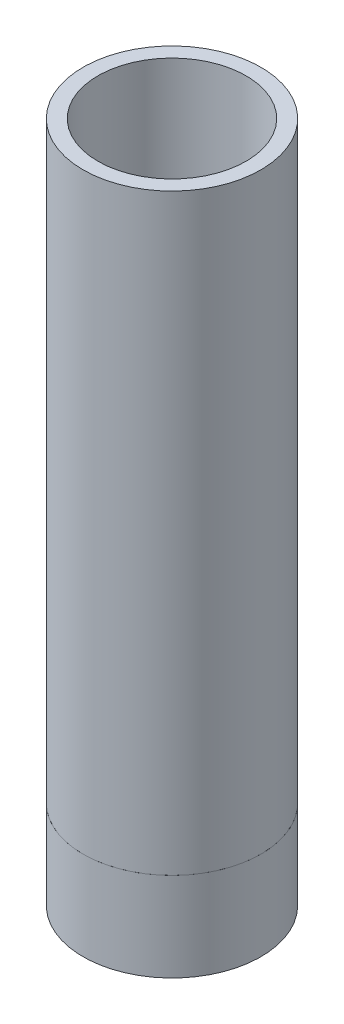
ISO-10303-21;
HEADER;
FILE_DESCRIPTION(('STEP AP214'),'2;1');
FILE_NAME('part.step','',(''),(''),'','','');
FILE_SCHEMA(('AUTOMOTIVE_DESIGN { 1 0 10303 214 1 1 1 1 }'));
ENDSEC;
DATA;
#1=APPLICATION_CONTEXT('core data for automotive mechanical design processes');
#2=APPLICATION_PROTOCOL_DEFINITION('international standard','automotive_design',2000,#1);
#3=PRODUCT_CONTEXT('',#1,'mechanical');
#4=PRODUCT('Part','Part','',(#3));
#5=PRODUCT_RELATED_PRODUCT_CATEGORY('part','',(#4));
#6=PRODUCT_DEFINITION_FORMATION('','',#4);
#7=PRODUCT_DEFINITION_CONTEXT('part definition',#1,'design');
#8=PRODUCT_DEFINITION('design','',#6,#7);
#9=PRODUCT_DEFINITION_SHAPE('','',#8);
#10=(LENGTH_UNIT() NAMED_UNIT(*) SI_UNIT(.MILLI.,.METRE.));
#11=(NAMED_UNIT(*) PLANE_ANGLE_UNIT() SI_UNIT($,.RADIAN.));
#12=(NAMED_UNIT(*) SI_UNIT($,.STERADIAN.) SOLID_ANGLE_UNIT());
#13=UNCERTAINTY_MEASURE_WITH_UNIT(LENGTH_MEASURE(1.E-05),#10,'distance_accuracy_value','');
#14=(GEOMETRIC_REPRESENTATION_CONTEXT(3) GLOBAL_UNCERTAINTY_ASSIGNED_CONTEXT((#13)) GLOBAL_UNIT_ASSIGNED_CONTEXT((#10,
#11,#12)) REPRESENTATION_CONTEXT('',''));
#15=CARTESIAN_POINT('',(0.,0.,0.));
#16=DIRECTION('',(0.,0.,1.));
#17=DIRECTION('',(1.,0.,0.));
#18=AXIS2_PLACEMENT_3D('',#15,#16,#17);
#19=CARTESIAN_POINT('',(0.,-15.,0.));
#20=DIRECTION('',(0.,-1.,0.));
#21=DIRECTION('',(0.,0.,-1.));
#22=AXIS2_PLACEMENT_3D('',#19,#20,#21);
#23=PLANE('',#22);
#24=CARTESIAN_POINT('',(0.,-15.,0.));
#25=DIRECTION('',(0.,-1.,0.));
#26=DIRECTION('',(0.,0.,-1.));
#27=AXIS2_PLACEMENT_3D('',#24,#25,#26);
#28=CIRCLE('',#27,15.);
#29=CARTESIAN_POINT('',(0.,-15.,-15.));
#30=VERTEX_POINT('',#29);
#31=EDGE_CURVE('E11',#30,#30,#28,.T.);
#32=ORIENTED_EDGE('',*,*,#31,.T.);
#33=EDGE_LOOP('',(#32));
#34=FACE_BOUND('',#33,.T.);
#35=CARTESIAN_POINT('',(0.,-15.,0.));
#36=DIRECTION('',(0.,-1.,0.));
#37=DIRECTION('',(0.,0.,-1.));
#38=AXIS2_PLACEMENT_3D('',#35,#36,#37);
#39=CIRCLE('',#38,12.5);
#40=CARTESIAN_POINT('',(0.,-15.,-12.5));
#41=VERTEX_POINT('',#40);
#42=EDGE_CURVE('E55',#41,#41,#39,.T.);
#43=ORIENTED_EDGE('',*,*,#42,.F.);
#44=EDGE_LOOP('',(#43));
#45=FACE_BOUND('',#44,.T.);
#46=ADVANCED_FACE('F44',(#34,#45),#23,.T.);
#47=CARTESIAN_POINT('',(0.,0.,0.));
#48=DIRECTION('',(0.,-1.,0.));
#49=DIRECTION('',(0.,0.,-1.));
#50=AXIS2_PLACEMENT_3D('',#47,#48,#49);
#51=PLANE('',#50);
#52=CARTESIAN_POINT('',(0.,0.,0.));
#53=DIRECTION('',(0.,-1.,0.));
#54=DIRECTION('',(0.,0.,-1.));
#55=AXIS2_PLACEMENT_3D('',#52,#53,#54);
#56=CIRCLE('',#55,15.);
#57=CARTESIAN_POINT('',(0.,0.,-15.));
#58=VERTEX_POINT('',#57);
#59=EDGE_CURVE('E48',#58,#58,#56,.T.);
#60=ORIENTED_EDGE('',*,*,#59,.F.);
#61=EDGE_LOOP('',(#60));
#62=FACE_BOUND('',#61,.T.);
#63=CARTESIAN_POINT('',(0.,0.,0.));
#64=DIRECTION('',(0.,-1.,0.));
#65=DIRECTION('',(0.,0.,-1.));
#66=AXIS2_PLACEMENT_3D('',#63,#64,#65);
#67=CIRCLE('',#66,12.5);
#68=CARTESIAN_POINT('',(0.,0.,-12.5));
#69=VERTEX_POINT('',#68);
#70=EDGE_CURVE('E57',#69,#69,#67,.T.);
#71=ORIENTED_EDGE('',*,*,#70,.T.);
#72=EDGE_LOOP('',(#71));
#73=FACE_BOUND('',#72,.T.);
#74=ADVANCED_FACE('F67',(#62,#73),#51,.F.);
#75=CARTESIAN_POINT('',(0.,-15.,0.));
#76=DIRECTION('',(0.,1.,0.));
#77=DIRECTION('',(0.,0.,1.));
#78=AXIS2_PLACEMENT_3D('',#75,#76,#77);
#79=CYLINDRICAL_SURFACE('',#78,15.);
#80=ORIENTED_EDGE('',*,*,#31,.F.);
#81=EDGE_LOOP('',(#80));
#82=FACE_BOUND('',#81,.T.);
#83=ORIENTED_EDGE('',*,*,#59,.T.);
#84=EDGE_LOOP('',(#83));
#85=FACE_BOUND('',#84,.T.);
#86=ADVANCED_FACE('F46',(#82,#85),#79,.T.);
#87=CARTESIAN_POINT('',(0.,-15.,0.));
#88=DIRECTION('',(0.,1.,0.));
#89=DIRECTION('',(0.,0.,1.));
#90=AXIS2_PLACEMENT_3D('',#87,#88,#89);
#91=CYLINDRICAL_SURFACE('',#90,12.5);
#92=ORIENTED_EDGE('',*,*,#42,.T.);
#93=EDGE_LOOP('',(#92));
#94=FACE_BOUND('',#93,.T.);
#95=ORIENTED_EDGE('',*,*,#70,.F.);
#96=EDGE_LOOP('',(#95));
#97=FACE_BOUND('',#96,.T.);
#98=ADVANCED_FACE('F63',(#94,#97),#91,.F.);
#99=CLOSED_SHELL('',(#46,#74,#86,#98));
#100=MANIFOLD_SOLID_BREP('B2',#99);
#101=CARTESIAN_POINT('',(0.,10.,0.));
#102=DIRECTION('',(0.,-1.,0.));
#103=DIRECTION('',(0.,0.,-1.));
#104=AXIS2_PLACEMENT_3D('',#101,#102,#103);
#105=CYLINDRICAL_SURFACE('',#104,12.5);
#106=DIRECTION('',(0.,1.,0.));
#107=VECTOR('',#106,1.);
#108=CARTESIAN_POINT('',(12.3623420111239,-5.,1.85));
#109=LINE('',#108,#107);
#110=CARTESIAN_POINT('',(12.3623420111239,0.,1.85));
#111=VERTEX_POINT('',#110);
#112=CARTESIAN_POINT('',(12.3623420111239,10.,1.85));
#113=VERTEX_POINT('',#112);
#114=EDGE_CURVE('E134',#111,#113,#109,.T.);
#115=ORIENTED_EDGE('',*,*,#114,.T.);
#116=CARTESIAN_POINT('',(0.,10.,0.));
#117=DIRECTION('',(0.,-1.,0.));
#118=DIRECTION('',(0.,0.,-1.));
#119=AXIS2_PLACEMENT_3D('',#116,#117,#118);
#120=CIRCLE('',#119,12.5);
#121=CARTESIAN_POINT('',(12.3805406136131,10.,-1.72401105410474));
#122=VERTEX_POINT('',#121);
#123=EDGE_CURVE('E167',#113,#122,#120,.T.);
#124=ORIENTED_EDGE('',*,*,#123,.T.);
#125=DIRECTION('',(0.,1.,0.));
#126=VECTOR('',#125,1.);
#127=CARTESIAN_POINT('',(12.3805406136131,-5.,-1.72401105410474));
#128=LINE('',#127,#126);
#129=CARTESIAN_POINT('',(12.3805406136131,0.,-1.72401105410474));
#130=VERTEX_POINT('',#129);
#131=EDGE_CURVE('E150',#130,#122,#128,.T.);
#132=ORIENTED_EDGE('',*,*,#131,.F.);
#133=CARTESIAN_POINT('',(0.,0.,0.));
#134=DIRECTION('',(0.,-1.,0.));
#135=DIRECTION('',(0.,0.,-1.));
#136=AXIS2_PLACEMENT_3D('',#133,#134,#135);
#137=CIRCLE('',#136,12.5);
#138=EDGE_CURVE('E171',#111,#130,#137,.T.);
#139=ORIENTED_EDGE('',*,*,#138,.F.);
#140=EDGE_LOOP('',(#115,#124,#132,#139));
#141=FACE_BOUND('',#140,.T.);
#142=ADVANCED_FACE('F113',(#141),#105,.T.);
#143=CARTESIAN_POINT('',(0.,10.,0.));
#144=DIRECTION('',(0.,-1.,0.));
#145=DIRECTION('',(0.,0.,-1.));
#146=AXIS2_PLACEMENT_3D('',#143,#144,#145);
#147=PLANE('',#146);
#148=ORIENTED_EDGE('',*,*,#123,.F.);
#149=DIRECTION('',(1.,0.,0.));
#150=VECTOR('',#149,1.);
#151=CARTESIAN_POINT('',(0.,10.,1.85));
#152=LINE('',#151,#150);
#153=CARTESIAN_POINT('',(10.65,10.,1.85));
#154=VERTEX_POINT('',#153);
#155=EDGE_CURVE('E161',#154,#113,#152,.T.);
#156=ORIENTED_EDGE('',*,*,#155,.F.);
#157=CARTESIAN_POINT('',(10.65,10.,0.));
#158=DIRECTION('',(0.,1.,0.));
#159=DIRECTION('',(0.,0.,1.));
#160=AXIS2_PLACEMENT_3D('',#157,#158,#159);
#161=CIRCLE('',#160,1.85);
#162=CARTESIAN_POINT('',(10.65,10.,-1.85));
#163=VERTEX_POINT('',#162);
#164=EDGE_CURVE('E169',#163,#154,#161,.T.);
#165=ORIENTED_EDGE('',*,*,#164,.F.);
#166=DIRECTION('',(0.997360333534414,0.,0.0726110535119963));
#167=VECTOR('',#166,1.);
#168=CARTESIAN_POINT('',(0.190126549646767,10.,-2.61151257002653));
#169=LINE('',#168,#167);
#170=EDGE_CURVE('E153',#163,#122,#169,.T.);
#171=ORIENTED_EDGE('',*,*,#170,.T.);
#172=EDGE_LOOP('',(#148,#156,#165,#171));
#173=FACE_BOUND('',#172,.T.);
#174=ADVANCED_FACE('F165',(#173),#147,.F.);
#175=CARTESIAN_POINT('',(0.,0.,0.));
#176=DIRECTION('',(0.,-1.,0.));
#177=DIRECTION('',(0.,0.,-1.));
#178=AXIS2_PLACEMENT_3D('',#175,#176,#177);
#179=PLANE('',#178);
#180=DIRECTION('',(-1.,0.,0.));
#181=VECTOR('',#180,1.);
#182=CARTESIAN_POINT('',(0.,0.,1.85));
#183=LINE('',#182,#181);
#184=CARTESIAN_POINT('',(10.65,0.,1.85));
#185=VERTEX_POINT('',#184);
#186=EDGE_CURVE('E42',#111,#185,#183,.T.);
#187=ORIENTED_EDGE('',*,*,#186,.F.);
#188=ORIENTED_EDGE('',*,*,#138,.T.);
#189=DIRECTION('',(-0.997360333534414,0.,-0.0726110535119963));
#190=VECTOR('',#189,1.);
#191=CARTESIAN_POINT('',(0.190126549646767,0.,-2.61151257002653));
#192=LINE('',#191,#190);
#193=CARTESIAN_POINT('',(10.65,0.,-1.85));
#194=VERTEX_POINT('',#193);
#195=EDGE_CURVE('E156',#130,#194,#192,.T.);
#196=ORIENTED_EDGE('',*,*,#195,.T.);
#197=CARTESIAN_POINT('',(10.65,0.,0.));
#198=DIRECTION('',(0.,-1.,0.));
#199=DIRECTION('',(0.,0.,-1.));
#200=AXIS2_PLACEMENT_3D('',#197,#198,#199);
#201=CIRCLE('',#200,1.85);
#202=EDGE_CURVE('E120',#185,#194,#201,.T.);
#203=ORIENTED_EDGE('',*,*,#202,.F.);
#204=EDGE_LOOP('',(#187,#188,#196,#203));
#205=FACE_BOUND('',#204,.T.);
#206=ADVANCED_FACE('F182',(#205),#179,.T.);
#207=CARTESIAN_POINT('',(0.,-5.,1.85));
#208=DIRECTION('',(0.,0.,1.));
#209=DIRECTION('',(1.,0.,0.));
#210=AXIS2_PLACEMENT_3D('',#207,#208,#209);
#211=PLANE('',#210);
#212=ORIENTED_EDGE('',*,*,#186,.T.);
#213=DIRECTION('',(0.,1.,0.));
#214=VECTOR('',#213,1.);
#215=CARTESIAN_POINT('',(10.65,-5.,1.85));
#216=LINE('',#215,#214);
#217=EDGE_CURVE('E180',#185,#154,#216,.T.);
#218=ORIENTED_EDGE('',*,*,#217,.T.);
#219=ORIENTED_EDGE('',*,*,#155,.T.);
#220=ORIENTED_EDGE('',*,*,#114,.F.);
#221=EDGE_LOOP('',(#212,#218,#219,#220));
#222=FACE_BOUND('',#221,.T.);
#223=ADVANCED_FACE('F183',(#222),#211,.F.);
#224=CARTESIAN_POINT('',(10.65,-5.,0.));
#225=DIRECTION('',(0.,1.,0.));
#226=DIRECTION('',(0.,0.,1.));
#227=AXIS2_PLACEMENT_3D('',#224,#225,#226);
#228=CYLINDRICAL_SURFACE('',#227,1.85);
#229=ORIENTED_EDGE('',*,*,#202,.T.);
#230=DIRECTION('',(0.,1.,0.));
#231=VECTOR('',#230,1.);
#232=CARTESIAN_POINT('',(10.65,-5.,-1.85));
#233=LINE('',#232,#231);
#234=EDGE_CURVE('E127',#194,#163,#233,.T.);
#235=ORIENTED_EDGE('',*,*,#234,.T.);
#236=ORIENTED_EDGE('',*,*,#164,.T.);
#237=ORIENTED_EDGE('',*,*,#217,.F.);
#238=EDGE_LOOP('',(#229,#235,#236,#237));
#239=FACE_BOUND('',#238,.T.);
#240=ADVANCED_FACE('F179',(#239),#228,.F.);
#241=CARTESIAN_POINT('',(0.190126549646767,-5.,-2.61151257002653));
#242=DIRECTION('',(-0.0726110535119963,0.,0.997360333534414));
#243=DIRECTION('',(0.997360333534414,0.,0.0726110535119963));
#244=AXIS2_PLACEMENT_3D('',#241,#242,#243);
#245=PLANE('',#244);
#246=ORIENTED_EDGE('',*,*,#131,.T.);
#247=ORIENTED_EDGE('',*,*,#170,.F.);
#248=ORIENTED_EDGE('',*,*,#234,.F.);
#249=ORIENTED_EDGE('',*,*,#195,.F.);
#250=EDGE_LOOP('',(#246,#247,#248,#249));
#251=FACE_BOUND('',#250,.T.);
#252=ADVANCED_FACE('F152',(#251),#245,.T.);
#253=CLOSED_SHELL('',(#142,#174,#206,#223,#240,#252));
#254=MANIFOLD_SOLID_BREP('B6',#253);
#255=CARTESIAN_POINT('',(0.,100.,0.));
#256=DIRECTION('',(0.,1.,0.));
#257=DIRECTION('',(0.,0.,1.));
#258=AXIS2_PLACEMENT_3D('',#255,#256,#257);
#259=PLANE('',#258);
#260=CARTESIAN_POINT('',(0.,100.,0.));
#261=DIRECTION('',(0.,1.,0.));
#262=DIRECTION('',(0.,0.,1.));
#263=AXIS2_PLACEMENT_3D('',#260,#261,#262);
#264=CIRCLE('',#263,15.);
#265=CARTESIAN_POINT('',(0.,100.,15.));
#266=VERTEX_POINT('',#265);
#267=EDGE_CURVE('E112',#266,#266,#264,.T.);
#268=ORIENTED_EDGE('',*,*,#267,.T.);
#269=EDGE_LOOP('',(#268));
#270=FACE_BOUND('',#269,.T.);
#271=CARTESIAN_POINT('',(0.,100.,0.));
#272=DIRECTION('',(0.,1.,0.));
#273=DIRECTION('',(0.,0.,1.));
#274=AXIS2_PLACEMENT_3D('',#271,#272,#273);
#275=CIRCLE('',#274,12.5);
#276=CARTESIAN_POINT('',(0.,100.,12.5));
#277=VERTEX_POINT('',#276);
#278=EDGE_CURVE('E251',#277,#277,#275,.T.);
#279=ORIENTED_EDGE('',*,*,#278,.F.);
#280=EDGE_LOOP('',(#279));
#281=FACE_BOUND('',#280,.T.);
#282=ADVANCED_FACE('F240',(#270,#281),#259,.T.);
#283=CARTESIAN_POINT('',(0.,0.,0.));
#284=DIRECTION('',(0.,1.,0.));
#285=DIRECTION('',(0.,0.,1.));
#286=AXIS2_PLACEMENT_3D('',#283,#284,#285);
#287=PLANE('',#286);
#288=CARTESIAN_POINT('',(0.,0.,0.));
#289=DIRECTION('',(0.,1.,0.));
#290=DIRECTION('',(0.,0.,1.));
#291=AXIS2_PLACEMENT_3D('',#288,#289,#290);
#292=CIRCLE('',#291,15.);
#293=CARTESIAN_POINT('',(0.,0.,15.));
#294=VERTEX_POINT('',#293);
#295=EDGE_CURVE('E244',#294,#294,#292,.T.);
#296=ORIENTED_EDGE('',*,*,#295,.F.);
#297=EDGE_LOOP('',(#296));
#298=FACE_BOUND('',#297,.T.);
#299=CARTESIAN_POINT('',(0.,0.,0.));
#300=DIRECTION('',(0.,1.,0.));
#301=DIRECTION('',(0.,0.,1.));
#302=AXIS2_PLACEMENT_3D('',#299,#300,#301);
#303=CIRCLE('',#302,12.5);
#304=CARTESIAN_POINT('',(0.,0.,12.5));
#305=VERTEX_POINT('',#304);
#306=EDGE_CURVE('E253',#305,#305,#303,.T.);
#307=ORIENTED_EDGE('',*,*,#306,.T.);
#308=EDGE_LOOP('',(#307));
#309=FACE_BOUND('',#308,.T.);
#310=ADVANCED_FACE('F263',(#298,#309),#287,.F.);
#311=CARTESIAN_POINT('',(0.,100.,0.));
#312=DIRECTION('',(0.,-1.,0.));
#313=DIRECTION('',(0.,0.,-1.));
#314=AXIS2_PLACEMENT_3D('',#311,#312,#313);
#315=CYLINDRICAL_SURFACE('',#314,15.);
#316=ORIENTED_EDGE('',*,*,#267,.F.);
#317=EDGE_LOOP('',(#316));
#318=FACE_BOUND('',#317,.T.);
#319=ORIENTED_EDGE('',*,*,#295,.T.);
#320=EDGE_LOOP('',(#319));
#321=FACE_BOUND('',#320,.T.);
#322=ADVANCED_FACE('F242',(#318,#321),#315,.T.);
#323=CARTESIAN_POINT('',(0.,100.,0.));
#324=DIRECTION('',(0.,-1.,0.));
#325=DIRECTION('',(0.,0.,-1.));
#326=AXIS2_PLACEMENT_3D('',#323,#324,#325);
#327=CYLINDRICAL_SURFACE('',#326,12.5);
#328=ORIENTED_EDGE('',*,*,#278,.T.);
#329=EDGE_LOOP('',(#328));
#330=FACE_BOUND('',#329,.T.);
#331=ORIENTED_EDGE('',*,*,#306,.F.);
#332=EDGE_LOOP('',(#331));
#333=FACE_BOUND('',#332,.T.);
#334=ADVANCED_FACE('F259',(#330,#333),#327,.F.);
#335=CLOSED_SHELL('',(#282,#310,#322,#334));
#336=MANIFOLD_SOLID_BREP('B36',#335);
#337=ADVANCED_BREP_SHAPE_REPRESENTATION('',(#18,#100,#254,#336),#14);
#338=SHAPE_DEFINITION_REPRESENTATION(#9,#337);
ENDSEC;
END-ISO-10303-21;
